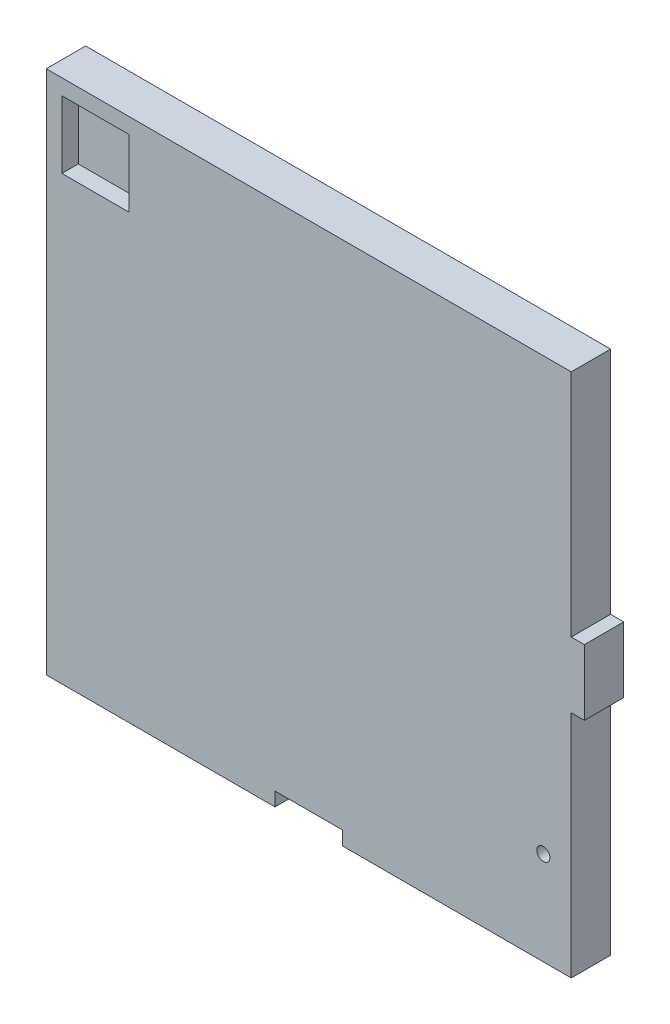
ISO-10303-21;
HEADER;
FILE_DESCRIPTION(('STEP AP214'),'2;1');
FILE_NAME('part.step','',(''),(''),'','','');
FILE_SCHEMA(('AUTOMOTIVE_DESIGN { 1 0 10303 214 1 1 1 1 }'));
ENDSEC;
DATA;
#1=APPLICATION_CONTEXT('core data for automotive mechanical design processes');
#2=APPLICATION_PROTOCOL_DEFINITION('international standard','automotive_design',2000,#1);
#3=PRODUCT_CONTEXT('',#1,'mechanical');
#4=PRODUCT('Part','Part','',(#3));
#5=PRODUCT_RELATED_PRODUCT_CATEGORY('part','',(#4));
#6=PRODUCT_DEFINITION_FORMATION('','',#4);
#7=PRODUCT_DEFINITION_CONTEXT('part definition',#1,'design');
#8=PRODUCT_DEFINITION('design','',#6,#7);
#9=PRODUCT_DEFINITION_SHAPE('','',#8);
#10=(LENGTH_UNIT() NAMED_UNIT(*) SI_UNIT(.MILLI.,.METRE.));
#11=(NAMED_UNIT(*) PLANE_ANGLE_UNIT() SI_UNIT($,.RADIAN.));
#12=(NAMED_UNIT(*) SI_UNIT($,.STERADIAN.) SOLID_ANGLE_UNIT());
#13=UNCERTAINTY_MEASURE_WITH_UNIT(LENGTH_MEASURE(1.E-05),#10,'distance_accuracy_value','');
#14=(GEOMETRIC_REPRESENTATION_CONTEXT(3) GLOBAL_UNCERTAINTY_ASSIGNED_CONTEXT((#13)) GLOBAL_UNIT_ASSIGNED_CONTEXT((#10,
#11,#12)) REPRESENTATION_CONTEXT('',''));
#15=CARTESIAN_POINT('',(0.,0.,0.));
#16=DIRECTION('',(0.,0.,1.));
#17=DIRECTION('',(1.,0.,0.));
#18=AXIS2_PLACEMENT_3D('',#15,#16,#17);
#19=CARTESIAN_POINT('',(151.500000000023,28.4999999999927,12.));
#20=DIRECTION('',(0.,0.,-1.));
#21=DIRECTION('',(-1.,0.,0.));
#22=AXIS2_PLACEMENT_3D('',#19,#20,#21);
#23=CYLINDRICAL_SURFACE('',#22,2.);
#24=CARTESIAN_POINT('',(151.500000000023,28.4999999999927,12.));
#25=DIRECTION('',(0.,0.,1.));
#26=DIRECTION('',(1.,0.,0.));
#27=AXIS2_PLACEMENT_3D('',#24,#25,#26);
#28=CIRCLE('',#27,2.);
#29=CARTESIAN_POINT('',(153.500000000023,28.4999999999927,12.));
#30=VERTEX_POINT('',#29);
#31=EDGE_CURVE('E176',#30,#30,#28,.T.);
#32=ORIENTED_EDGE('',*,*,#31,.T.);
#33=EDGE_LOOP('',(#32));
#34=FACE_BOUND('',#33,.T.);
#35=CARTESIAN_POINT('',(151.500000000023,28.4999999999927,8.));
#36=DIRECTION('',(0.,0.,-1.));
#37=DIRECTION('',(-1.,0.,0.));
#38=AXIS2_PLACEMENT_3D('',#35,#36,#37);
#39=CIRCLE('',#38,2.);
#40=CARTESIAN_POINT('',(149.500000000023,28.4999999999927,8.));
#41=VERTEX_POINT('',#40);
#42=EDGE_CURVE('E43',#41,#41,#39,.T.);
#43=ORIENTED_EDGE('',*,*,#42,.T.);
#44=EDGE_LOOP('',(#43));
#45=FACE_BOUND('',#44,.T.);
#46=ADVANCED_FACE('F39',(#34,#45),#23,.F.);
#47=CARTESIAN_POINT('',(0.,0.,12.));
#48=DIRECTION('',(0.,0.,1.));
#49=DIRECTION('',(1.,0.,0.));
#50=AXIS2_PLACEMENT_3D('',#47,#48,#49);
#51=PLANE('',#50);
#52=DIRECTION('',(0.,-1.,0.));
#53=VECTOR('',#52,1.);
#54=CARTESIAN_POINT('',(4.75,155.25,12.));
#55=LINE('',#54,#53);
#56=CARTESIAN_POINT('',(4.75,155.25,12.));
#57=VERTEX_POINT('',#56);
#58=CARTESIAN_POINT('',(4.75,134.75,12.));
#59=VERTEX_POINT('',#58);
#60=EDGE_CURVE('E54',#57,#59,#55,.T.);
#61=ORIENTED_EDGE('',*,*,#60,.F.);
#62=DIRECTION('',(-1.,0.,0.));
#63=VECTOR('',#62,1.);
#64=CARTESIAN_POINT('',(25.25,155.25,12.));
#65=LINE('',#64,#63);
#66=CARTESIAN_POINT('',(25.25,155.25,12.));
#67=VERTEX_POINT('',#66);
#68=EDGE_CURVE('E283',#67,#57,#65,.T.);
#69=ORIENTED_EDGE('',*,*,#68,.F.);
#70=DIRECTION('',(0.,1.,0.));
#71=VECTOR('',#70,1.);
#72=CARTESIAN_POINT('',(25.25,134.75,12.));
#73=LINE('',#72,#71);
#74=CARTESIAN_POINT('',(25.25,134.75,12.));
#75=VERTEX_POINT('',#74);
#76=EDGE_CURVE('E286',#75,#67,#73,.T.);
#77=ORIENTED_EDGE('',*,*,#76,.F.);
#78=DIRECTION('',(1.,0.,0.));
#79=VECTOR('',#78,1.);
#80=CARTESIAN_POINT('',(4.75,134.75,12.));
#81=LINE('',#80,#79);
#82=EDGE_CURVE('E292',#59,#75,#81,.T.);
#83=ORIENTED_EDGE('',*,*,#82,.F.);
#84=EDGE_LOOP('',(#61,#69,#77,#83));
#85=FACE_BOUND('',#84,.T.);
#86=DIRECTION('',(0.,-1.,0.));
#87=VECTOR('',#86,1.);
#88=CARTESIAN_POINT('',(0.,69.7,12.));
#89=LINE('',#88,#87);
#90=CARTESIAN_POINT('',(0.,160.,12.));
#91=VERTEX_POINT('',#90);
#92=CARTESIAN_POINT('',(0.,0.,12.));
#93=VERTEX_POINT('',#92);
#94=EDGE_CURVE('E196',#91,#93,#89,.T.);
#95=ORIENTED_EDGE('',*,*,#94,.T.);
#96=DIRECTION('',(1.,0.,0.));
#97=VECTOR('',#96,1.);
#98=CARTESIAN_POINT('',(0.,0.,12.));
#99=LINE('',#98,#97);
#100=CARTESIAN_POINT('',(69.7,0.,12.));
#101=VERTEX_POINT('',#100);
#102=EDGE_CURVE('E116',#93,#101,#99,.T.);
#103=ORIENTED_EDGE('',*,*,#102,.T.);
#104=DIRECTION('',(0.,1.,0.));
#105=VECTOR('',#104,1.);
#106=CARTESIAN_POINT('',(69.7,0.,12.));
#107=LINE('',#106,#105);
#108=CARTESIAN_POINT('',(69.7,4.2,12.));
#109=VERTEX_POINT('',#108);
#110=EDGE_CURVE('E230',#101,#109,#107,.T.);
#111=ORIENTED_EDGE('',*,*,#110,.T.);
#112=DIRECTION('',(1.,0.,0.));
#113=VECTOR('',#112,1.);
#114=CARTESIAN_POINT('',(69.7,4.2,12.));
#115=LINE('',#114,#113);
#116=CARTESIAN_POINT('',(90.3,4.2,12.));
#117=VERTEX_POINT('',#116);
#118=EDGE_CURVE('E242',#109,#117,#115,.T.);
#119=ORIENTED_EDGE('',*,*,#118,.T.);
#120=DIRECTION('',(0.,-1.,0.));
#121=VECTOR('',#120,1.);
#122=CARTESIAN_POINT('',(90.3,4.2,12.));
#123=LINE('',#122,#121);
#124=CARTESIAN_POINT('',(90.3,0.,12.));
#125=VERTEX_POINT('',#124);
#126=EDGE_CURVE('E238',#117,#125,#123,.T.);
#127=ORIENTED_EDGE('',*,*,#126,.T.);
#128=DIRECTION('',(1.,0.,0.));
#129=VECTOR('',#128,1.);
#130=CARTESIAN_POINT('',(90.3,0.,12.));
#131=LINE('',#130,#129);
#132=CARTESIAN_POINT('',(160.,0.,12.));
#133=VERTEX_POINT('',#132);
#134=EDGE_CURVE('E245',#125,#133,#131,.T.);
#135=ORIENTED_EDGE('',*,*,#134,.T.);
#136=DIRECTION('',(0.,1.,0.));
#137=VECTOR('',#136,1.);
#138=CARTESIAN_POINT('',(160.,0.,12.));
#139=LINE('',#138,#137);
#140=CARTESIAN_POINT('',(160.,70.,12.));
#141=VERTEX_POINT('',#140);
#142=EDGE_CURVE('E244',#133,#141,#139,.T.);
#143=ORIENTED_EDGE('',*,*,#142,.T.);
#144=DIRECTION('',(1.,0.,0.));
#145=VECTOR('',#144,1.);
#146=CARTESIAN_POINT('',(160.,70.,12.));
#147=LINE('',#146,#145);
#148=CARTESIAN_POINT('',(164.,70.,12.));
#149=VERTEX_POINT('',#148);
#150=EDGE_CURVE('E253',#141,#149,#147,.T.);
#151=ORIENTED_EDGE('',*,*,#150,.T.);
#152=DIRECTION('',(0.,1.,0.));
#153=VECTOR('',#152,1.);
#154=CARTESIAN_POINT('',(164.,70.,12.));
#155=LINE('',#154,#153);
#156=CARTESIAN_POINT('',(164.,90.,12.));
#157=VERTEX_POINT('',#156);
#158=EDGE_CURVE('E155',#149,#157,#155,.T.);
#159=ORIENTED_EDGE('',*,*,#158,.T.);
#160=DIRECTION('',(-1.,0.,0.));
#161=VECTOR('',#160,1.);
#162=CARTESIAN_POINT('',(164.,90.,12.));
#163=LINE('',#162,#161);
#164=CARTESIAN_POINT('',(160.,90.,12.));
#165=VERTEX_POINT('',#164);
#166=EDGE_CURVE('E145',#157,#165,#163,.T.);
#167=ORIENTED_EDGE('',*,*,#166,.T.);
#168=DIRECTION('',(0.,1.,0.));
#169=VECTOR('',#168,1.);
#170=CARTESIAN_POINT('',(160.,90.,12.));
#171=LINE('',#170,#169);
#172=CARTESIAN_POINT('',(160.,160.,12.));
#173=VERTEX_POINT('',#172);
#174=EDGE_CURVE('E149',#165,#173,#171,.T.);
#175=ORIENTED_EDGE('',*,*,#174,.T.);
#176=DIRECTION('',(-1.,0.,0.));
#177=VECTOR('',#176,1.);
#178=CARTESIAN_POINT('',(160.,160.,12.));
#179=LINE('',#178,#177);
#180=EDGE_CURVE('E63',#173,#91,#179,.T.);
#181=ORIENTED_EDGE('',*,*,#180,.T.);
#182=EDGE_LOOP('',(#95,#103,#111,#119,#127,#135,#143,#151,#159,#167,#175,#181));
#183=FACE_BOUND('',#182,.T.);
#184=ORIENTED_EDGE('',*,*,#31,.F.);
#185=EDGE_LOOP('',(#184));
#186=FACE_BOUND('',#185,.T.);
#187=ADVANCED_FACE('F148',(#85,#183,#186),#51,.T.);
#188=CARTESIAN_POINT('',(0.,0.,0.));
#189=DIRECTION('',(0.,0.,1.));
#190=DIRECTION('',(1.,0.,0.));
#191=AXIS2_PLACEMENT_3D('',#188,#189,#190);
#192=PLANE('',#191);
#193=CARTESIAN_POINT('',(151.500000000023,28.4999999999927,0.));
#194=DIRECTION('',(0.,0.,-1.));
#195=DIRECTION('',(-1.,0.,0.));
#196=AXIS2_PLACEMENT_3D('',#193,#194,#195);
#197=CIRCLE('',#196,3.45);
#198=CARTESIAN_POINT('',(148.050000000023,28.4999999999927,0.));
#199=VERTEX_POINT('',#198);
#200=EDGE_CURVE('E304',#199,#199,#197,.T.);
#201=ORIENTED_EDGE('',*,*,#200,.F.);
#202=EDGE_LOOP('',(#201));
#203=FACE_BOUND('',#202,.T.);
#204=DIRECTION('',(1.,0.,0.));
#205=VECTOR('',#204,1.);
#206=CARTESIAN_POINT('',(0.,0.,0.));
#207=LINE('',#206,#205);
#208=CARTESIAN_POINT('',(0.,0.,0.));
#209=VERTEX_POINT('',#208);
#210=CARTESIAN_POINT('',(69.7,0.,0.));
#211=VERTEX_POINT('',#210);
#212=EDGE_CURVE('E174',#209,#211,#207,.T.);
#213=ORIENTED_EDGE('',*,*,#212,.F.);
#214=DIRECTION('',(0.,-1.,0.));
#215=VECTOR('',#214,1.);
#216=CARTESIAN_POINT('',(0.,90.3,0.));
#217=LINE('',#216,#215);
#218=CARTESIAN_POINT('',(0.,160.,0.));
#219=VERTEX_POINT('',#218);
#220=EDGE_CURVE('E107',#219,#209,#217,.T.);
#221=ORIENTED_EDGE('',*,*,#220,.F.);
#222=DIRECTION('',(-1.,0.,0.));
#223=VECTOR('',#222,1.);
#224=CARTESIAN_POINT('',(70.,160.,0.));
#225=LINE('',#224,#223);
#226=CARTESIAN_POINT('',(160.,160.,0.));
#227=VERTEX_POINT('',#226);
#228=EDGE_CURVE('E194',#227,#219,#225,.T.);
#229=ORIENTED_EDGE('',*,*,#228,.F.);
#230=DIRECTION('',(0.,1.,0.));
#231=VECTOR('',#230,1.);
#232=CARTESIAN_POINT('',(160.,90.,0.));
#233=LINE('',#232,#231);
#234=CARTESIAN_POINT('',(160.,90.,0.));
#235=VERTEX_POINT('',#234);
#236=EDGE_CURVE('E191',#235,#227,#233,.T.);
#237=ORIENTED_EDGE('',*,*,#236,.F.);
#238=DIRECTION('',(-1.,0.,0.));
#239=VECTOR('',#238,1.);
#240=CARTESIAN_POINT('',(164.,90.,0.));
#241=LINE('',#240,#239);
#242=CARTESIAN_POINT('',(164.,90.,0.));
#243=VERTEX_POINT('',#242);
#244=EDGE_CURVE('E161',#243,#235,#241,.T.);
#245=ORIENTED_EDGE('',*,*,#244,.F.);
#246=DIRECTION('',(0.,1.,0.));
#247=VECTOR('',#246,1.);
#248=CARTESIAN_POINT('',(164.,70.,0.));
#249=LINE('',#248,#247);
#250=CARTESIAN_POINT('',(164.,70.,0.));
#251=VERTEX_POINT('',#250);
#252=EDGE_CURVE('E189',#251,#243,#249,.T.);
#253=ORIENTED_EDGE('',*,*,#252,.F.);
#254=DIRECTION('',(1.,0.,0.));
#255=VECTOR('',#254,1.);
#256=CARTESIAN_POINT('',(160.,70.,0.));
#257=LINE('',#256,#255);
#258=CARTESIAN_POINT('',(160.,70.,0.));
#259=VERTEX_POINT('',#258);
#260=EDGE_CURVE('E187',#259,#251,#257,.T.);
#261=ORIENTED_EDGE('',*,*,#260,.F.);
#262=DIRECTION('',(0.,1.,0.));
#263=VECTOR('',#262,1.);
#264=CARTESIAN_POINT('',(160.,0.,0.));
#265=LINE('',#264,#263);
#266=CARTESIAN_POINT('',(160.,0.,0.));
#267=VERTEX_POINT('',#266);
#268=EDGE_CURVE('E186',#267,#259,#265,.T.);
#269=ORIENTED_EDGE('',*,*,#268,.F.);
#270=DIRECTION('',(1.,0.,0.));
#271=VECTOR('',#270,1.);
#272=CARTESIAN_POINT('',(90.3,0.,0.));
#273=LINE('',#272,#271);
#274=CARTESIAN_POINT('',(90.3,0.,0.));
#275=VERTEX_POINT('',#274);
#276=EDGE_CURVE('E184',#275,#267,#273,.T.);
#277=ORIENTED_EDGE('',*,*,#276,.F.);
#278=DIRECTION('',(0.,-1.,0.));
#279=VECTOR('',#278,1.);
#280=CARTESIAN_POINT('',(90.3,4.2,0.));
#281=LINE('',#280,#279);
#282=CARTESIAN_POINT('',(90.3,4.2,0.));
#283=VERTEX_POINT('',#282);
#284=EDGE_CURVE('E185',#283,#275,#281,.T.);
#285=ORIENTED_EDGE('',*,*,#284,.F.);
#286=DIRECTION('',(1.,0.,0.));
#287=VECTOR('',#286,1.);
#288=CARTESIAN_POINT('',(69.7,4.2,0.));
#289=LINE('',#288,#287);
#290=CARTESIAN_POINT('',(69.7,4.2,0.));
#291=VERTEX_POINT('',#290);
#292=EDGE_CURVE('E179',#291,#283,#289,.T.);
#293=ORIENTED_EDGE('',*,*,#292,.F.);
#294=DIRECTION('',(0.,1.,0.));
#295=VECTOR('',#294,1.);
#296=CARTESIAN_POINT('',(69.7,0.,0.));
#297=LINE('',#296,#295);
#298=EDGE_CURVE('E180',#211,#291,#297,.T.);
#299=ORIENTED_EDGE('',*,*,#298,.F.);
#300=EDGE_LOOP('',(#213,#221,#229,#237,#245,#253,#261,#269,#277,#285,#293,#299));
#301=FACE_BOUND('',#300,.T.);
#302=ADVANCED_FACE('F228',(#203,#301),#192,.F.);
#303=CARTESIAN_POINT('',(0.,0.,12.));
#304=DIRECTION('',(0.,1.,0.));
#305=DIRECTION('',(0.,0.,1.));
#306=AXIS2_PLACEMENT_3D('',#303,#304,#305);
#307=PLANE('',#306);
#308=ORIENTED_EDGE('',*,*,#212,.T.);
#309=DIRECTION('',(0.,0.,-1.));
#310=VECTOR('',#309,1.);
#311=CARTESIAN_POINT('',(69.7,0.,12.));
#312=LINE('',#311,#310);
#313=EDGE_CURVE('E48',#101,#211,#312,.T.);
#314=ORIENTED_EDGE('',*,*,#313,.F.);
#315=ORIENTED_EDGE('',*,*,#102,.F.);
#316=DIRECTION('',(0.,0.,-1.));
#317=VECTOR('',#316,1.);
#318=CARTESIAN_POINT('',(0.,0.,12.));
#319=LINE('',#318,#317);
#320=EDGE_CURVE('E11',#93,#209,#319,.T.);
#321=ORIENTED_EDGE('',*,*,#320,.T.);
#322=EDGE_LOOP('',(#308,#314,#315,#321));
#323=FACE_BOUND('',#322,.T.);
#324=ADVANCED_FACE('F41',(#323),#307,.F.);
#325=CARTESIAN_POINT('',(69.7,0.,12.));
#326=DIRECTION('',(-1.,0.,0.));
#327=DIRECTION('',(0.,0.,1.));
#328=AXIS2_PLACEMENT_3D('',#325,#326,#327);
#329=PLANE('',#328);
#330=ORIENTED_EDGE('',*,*,#298,.T.);
#331=DIRECTION('',(0.,0.,-1.));
#332=VECTOR('',#331,1.);
#333=CARTESIAN_POINT('',(69.7,4.2,12.));
#334=LINE('',#333,#332);
#335=EDGE_CURVE('E217',#109,#291,#334,.T.);
#336=ORIENTED_EDGE('',*,*,#335,.F.);
#337=ORIENTED_EDGE('',*,*,#110,.F.);
#338=ORIENTED_EDGE('',*,*,#313,.T.);
#339=EDGE_LOOP('',(#330,#336,#337,#338));
#340=FACE_BOUND('',#339,.T.);
#341=ADVANCED_FACE('F223',(#340),#329,.F.);
#342=CARTESIAN_POINT('',(69.7,4.2,12.));
#343=DIRECTION('',(0.,1.,0.));
#344=DIRECTION('',(0.,0.,1.));
#345=AXIS2_PLACEMENT_3D('',#342,#343,#344);
#346=PLANE('',#345);
#347=ORIENTED_EDGE('',*,*,#292,.T.);
#348=DIRECTION('',(0.,0.,-1.));
#349=VECTOR('',#348,1.);
#350=CARTESIAN_POINT('',(90.3,4.2,12.));
#351=LINE('',#350,#349);
#352=EDGE_CURVE('E214',#117,#283,#351,.T.);
#353=ORIENTED_EDGE('',*,*,#352,.F.);
#354=ORIENTED_EDGE('',*,*,#118,.F.);
#355=ORIENTED_EDGE('',*,*,#335,.T.);
#356=EDGE_LOOP('',(#347,#353,#354,#355));
#357=FACE_BOUND('',#356,.T.);
#358=ADVANCED_FACE('F232',(#357),#346,.F.);
#359=CARTESIAN_POINT('',(90.3,4.2,12.));
#360=DIRECTION('',(1.,0.,0.));
#361=DIRECTION('',(0.,0.,-1.));
#362=AXIS2_PLACEMENT_3D('',#359,#360,#361);
#363=PLANE('',#362);
#364=ORIENTED_EDGE('',*,*,#284,.T.);
#365=DIRECTION('',(0.,0.,-1.));
#366=VECTOR('',#365,1.);
#367=CARTESIAN_POINT('',(90.3,0.,12.));
#368=LINE('',#367,#366);
#369=EDGE_CURVE('E215',#125,#275,#368,.T.);
#370=ORIENTED_EDGE('',*,*,#369,.F.);
#371=ORIENTED_EDGE('',*,*,#126,.F.);
#372=ORIENTED_EDGE('',*,*,#352,.T.);
#373=EDGE_LOOP('',(#364,#370,#371,#372));
#374=FACE_BOUND('',#373,.T.);
#375=ADVANCED_FACE('F236',(#374),#363,.F.);
#376=CARTESIAN_POINT('',(90.3,0.,12.));
#377=DIRECTION('',(0.,1.,0.));
#378=DIRECTION('',(0.,0.,1.));
#379=AXIS2_PLACEMENT_3D('',#376,#377,#378);
#380=PLANE('',#379);
#381=ORIENTED_EDGE('',*,*,#276,.T.);
#382=DIRECTION('',(0.,0.,-1.));
#383=VECTOR('',#382,1.);
#384=CARTESIAN_POINT('',(160.,0.,12.));
#385=LINE('',#384,#383);
#386=EDGE_CURVE('E207',#133,#267,#385,.T.);
#387=ORIENTED_EDGE('',*,*,#386,.F.);
#388=ORIENTED_EDGE('',*,*,#134,.F.);
#389=ORIENTED_EDGE('',*,*,#369,.T.);
#390=EDGE_LOOP('',(#381,#387,#388,#389));
#391=FACE_BOUND('',#390,.T.);
#392=ADVANCED_FACE('F360',(#391),#380,.F.);
#393=CARTESIAN_POINT('',(160.,0.,12.));
#394=DIRECTION('',(-1.,0.,0.));
#395=DIRECTION('',(0.,0.,1.));
#396=AXIS2_PLACEMENT_3D('',#393,#394,#395);
#397=PLANE('',#396);
#398=ORIENTED_EDGE('',*,*,#268,.T.);
#399=DIRECTION('',(0.,0.,-1.));
#400=VECTOR('',#399,1.);
#401=CARTESIAN_POINT('',(160.,70.,12.));
#402=LINE('',#401,#400);
#403=EDGE_CURVE('E206',#141,#259,#402,.T.);
#404=ORIENTED_EDGE('',*,*,#403,.F.);
#405=ORIENTED_EDGE('',*,*,#142,.F.);
#406=ORIENTED_EDGE('',*,*,#386,.T.);
#407=EDGE_LOOP('',(#398,#404,#405,#406));
#408=FACE_BOUND('',#407,.T.);
#409=ADVANCED_FACE('F353',(#408),#397,.F.);
#410=CARTESIAN_POINT('',(160.,70.,12.));
#411=DIRECTION('',(0.,1.,0.));
#412=DIRECTION('',(0.,0.,1.));
#413=AXIS2_PLACEMENT_3D('',#410,#411,#412);
#414=PLANE('',#413);
#415=ORIENTED_EDGE('',*,*,#260,.T.);
#416=DIRECTION('',(0.,0.,-1.));
#417=VECTOR('',#416,1.);
#418=CARTESIAN_POINT('',(164.,70.,12.));
#419=LINE('',#418,#417);
#420=EDGE_CURVE('E201',#149,#251,#419,.T.);
#421=ORIENTED_EDGE('',*,*,#420,.F.);
#422=ORIENTED_EDGE('',*,*,#150,.F.);
#423=ORIENTED_EDGE('',*,*,#403,.T.);
#424=EDGE_LOOP('',(#415,#421,#422,#423));
#425=FACE_BOUND('',#424,.T.);
#426=ADVANCED_FACE('F260',(#425),#414,.F.);
#427=CARTESIAN_POINT('',(164.,70.,12.));
#428=DIRECTION('',(-1.,0.,0.));
#429=DIRECTION('',(0.,0.,1.));
#430=AXIS2_PLACEMENT_3D('',#427,#428,#429);
#431=PLANE('',#430);
#432=ORIENTED_EDGE('',*,*,#252,.T.);
#433=DIRECTION('',(0.,0.,-1.));
#434=VECTOR('',#433,1.);
#435=CARTESIAN_POINT('',(164.,90.,12.));
#436=LINE('',#435,#434);
#437=EDGE_CURVE('E164',#157,#243,#436,.T.);
#438=ORIENTED_EDGE('',*,*,#437,.F.);
#439=ORIENTED_EDGE('',*,*,#158,.F.);
#440=ORIENTED_EDGE('',*,*,#420,.T.);
#441=EDGE_LOOP('',(#432,#438,#439,#440));
#442=FACE_BOUND('',#441,.T.);
#443=ADVANCED_FACE('F261',(#442),#431,.F.);
#444=CARTESIAN_POINT('',(164.,90.,12.));
#445=DIRECTION('',(0.,-1.,0.));
#446=DIRECTION('',(0.,0.,-1.));
#447=AXIS2_PLACEMENT_3D('',#444,#445,#446);
#448=PLANE('',#447);
#449=ORIENTED_EDGE('',*,*,#244,.T.);
#450=DIRECTION('',(0.,0.,-1.));
#451=VECTOR('',#450,1.);
#452=CARTESIAN_POINT('',(160.,90.,12.));
#453=LINE('',#452,#451);
#454=EDGE_CURVE('E158',#165,#235,#453,.T.);
#455=ORIENTED_EDGE('',*,*,#454,.F.);
#456=ORIENTED_EDGE('',*,*,#166,.F.);
#457=ORIENTED_EDGE('',*,*,#437,.T.);
#458=EDGE_LOOP('',(#449,#455,#456,#457));
#459=FACE_BOUND('',#458,.T.);
#460=ADVANCED_FACE('F157',(#459),#448,.F.);
#461=CARTESIAN_POINT('',(160.,90.,12.));
#462=DIRECTION('',(-1.,0.,0.));
#463=DIRECTION('',(0.,0.,1.));
#464=AXIS2_PLACEMENT_3D('',#461,#462,#463);
#465=PLANE('',#464);
#466=ORIENTED_EDGE('',*,*,#236,.T.);
#467=DIRECTION('',(0.,0.,-1.));
#468=VECTOR('',#467,1.);
#469=CARTESIAN_POINT('',(160.,160.,12.));
#470=LINE('',#469,#468);
#471=EDGE_CURVE('E167',#173,#227,#470,.T.);
#472=ORIENTED_EDGE('',*,*,#471,.F.);
#473=ORIENTED_EDGE('',*,*,#174,.F.);
#474=ORIENTED_EDGE('',*,*,#454,.T.);
#475=EDGE_LOOP('',(#466,#472,#473,#474));
#476=FACE_BOUND('',#475,.T.);
#477=ADVANCED_FACE('F169',(#476),#465,.F.);
#478=CARTESIAN_POINT('',(70.,160.,12.));
#479=DIRECTION('',(0.,-1.,0.));
#480=DIRECTION('',(0.,0.,-1.));
#481=AXIS2_PLACEMENT_3D('',#478,#479,#480);
#482=PLANE('',#481);
#483=ORIENTED_EDGE('',*,*,#228,.T.);
#484=DIRECTION('',(0.,0.,-1.));
#485=VECTOR('',#484,1.);
#486=CARTESIAN_POINT('',(0.,160.,12.));
#487=LINE('',#486,#485);
#488=EDGE_CURVE('E171',#91,#219,#487,.T.);
#489=ORIENTED_EDGE('',*,*,#488,.F.);
#490=ORIENTED_EDGE('',*,*,#180,.F.);
#491=ORIENTED_EDGE('',*,*,#471,.T.);
#492=EDGE_LOOP('',(#483,#489,#490,#491));
#493=FACE_BOUND('',#492,.T.);
#494=ADVANCED_FACE('F263',(#493),#482,.F.);
#495=CARTESIAN_POINT('',(0.,90.3,12.));
#496=DIRECTION('',(1.,0.,0.));
#497=DIRECTION('',(0.,0.,-1.));
#498=AXIS2_PLACEMENT_3D('',#495,#496,#497);
#499=PLANE('',#498);
#500=ORIENTED_EDGE('',*,*,#220,.T.);
#501=ORIENTED_EDGE('',*,*,#320,.F.);
#502=ORIENTED_EDGE('',*,*,#94,.F.);
#503=ORIENTED_EDGE('',*,*,#488,.T.);
#504=EDGE_LOOP('',(#500,#501,#502,#503));
#505=FACE_BOUND('',#504,.T.);
#506=ADVANCED_FACE('F266',(#505),#499,.F.);
#507=CARTESIAN_POINT('',(4.75,155.25,7.));
#508=DIRECTION('',(-1.,0.,0.));
#509=DIRECTION('',(0.,0.,1.));
#510=AXIS2_PLACEMENT_3D('',#507,#508,#509);
#511=PLANE('',#510);
#512=ORIENTED_EDGE('',*,*,#60,.T.);
#513=DIRECTION('',(0.,0.,1.));
#514=VECTOR('',#513,1.);
#515=CARTESIAN_POINT('',(4.75,134.75,7.));
#516=LINE('',#515,#514);
#517=CARTESIAN_POINT('',(4.75,134.75,7.));
#518=VERTEX_POINT('',#517);
#519=EDGE_CURVE('E273',#518,#59,#516,.T.);
#520=ORIENTED_EDGE('',*,*,#519,.F.);
#521=DIRECTION('',(0.,-1.,0.));
#522=VECTOR('',#521,1.);
#523=CARTESIAN_POINT('',(4.75,155.25,7.));
#524=LINE('',#523,#522);
#525=CARTESIAN_POINT('',(4.75,155.25,7.));
#526=VERTEX_POINT('',#525);
#527=EDGE_CURVE('E290',#526,#518,#524,.T.);
#528=ORIENTED_EDGE('',*,*,#527,.F.);
#529=DIRECTION('',(0.,0.,1.));
#530=VECTOR('',#529,1.);
#531=CARTESIAN_POINT('',(4.75,155.25,7.));
#532=LINE('',#531,#530);
#533=EDGE_CURVE('E272',#526,#57,#532,.T.);
#534=ORIENTED_EDGE('',*,*,#533,.T.);
#535=EDGE_LOOP('',(#512,#520,#528,#534));
#536=FACE_BOUND('',#535,.T.);
#537=ADVANCED_FACE('F340',(#536),#511,.F.);
#538=CARTESIAN_POINT('',(25.25,155.25,7.));
#539=DIRECTION('',(0.,1.,0.));
#540=DIRECTION('',(0.,0.,1.));
#541=AXIS2_PLACEMENT_3D('',#538,#539,#540);
#542=PLANE('',#541);
#543=ORIENTED_EDGE('',*,*,#68,.T.);
#544=ORIENTED_EDGE('',*,*,#533,.F.);
#545=DIRECTION('',(-1.,0.,0.));
#546=VECTOR('',#545,1.);
#547=CARTESIAN_POINT('',(25.25,155.25,7.));
#548=LINE('',#547,#546);
#549=CARTESIAN_POINT('',(25.25,155.25,7.));
#550=VERTEX_POINT('',#549);
#551=EDGE_CURVE('E280',#550,#526,#548,.T.);
#552=ORIENTED_EDGE('',*,*,#551,.F.);
#553=DIRECTION('',(0.,0.,1.));
#554=VECTOR('',#553,1.);
#555=CARTESIAN_POINT('',(25.25,155.25,7.));
#556=LINE('',#555,#554);
#557=EDGE_CURVE('E278',#550,#67,#556,.T.);
#558=ORIENTED_EDGE('',*,*,#557,.T.);
#559=EDGE_LOOP('',(#543,#544,#552,#558));
#560=FACE_BOUND('',#559,.T.);
#561=ADVANCED_FACE('F465',(#560),#542,.F.);
#562=CARTESIAN_POINT('',(25.25,134.75,7.));
#563=DIRECTION('',(1.,0.,0.));
#564=DIRECTION('',(0.,0.,-1.));
#565=AXIS2_PLACEMENT_3D('',#562,#563,#564);
#566=PLANE('',#565);
#567=ORIENTED_EDGE('',*,*,#76,.T.);
#568=ORIENTED_EDGE('',*,*,#557,.F.);
#569=DIRECTION('',(0.,1.,0.));
#570=VECTOR('',#569,1.);
#571=CARTESIAN_POINT('',(25.25,134.75,7.));
#572=LINE('',#571,#570);
#573=CARTESIAN_POINT('',(25.25,134.75,7.));
#574=VERTEX_POINT('',#573);
#575=EDGE_CURVE('E300',#574,#550,#572,.T.);
#576=ORIENTED_EDGE('',*,*,#575,.F.);
#577=DIRECTION('',(0.,0.,1.));
#578=VECTOR('',#577,1.);
#579=CARTESIAN_POINT('',(25.25,134.75,7.));
#580=LINE('',#579,#578);
#581=EDGE_CURVE('E277',#574,#75,#580,.T.);
#582=ORIENTED_EDGE('',*,*,#581,.T.);
#583=EDGE_LOOP('',(#567,#568,#576,#582));
#584=FACE_BOUND('',#583,.T.);
#585=ADVANCED_FACE('F469',(#584),#566,.F.);
#586=CARTESIAN_POINT('',(4.75,134.75,7.));
#587=DIRECTION('',(0.,-1.,0.));
#588=DIRECTION('',(0.,0.,-1.));
#589=AXIS2_PLACEMENT_3D('',#586,#587,#588);
#590=PLANE('',#589);
#591=ORIENTED_EDGE('',*,*,#82,.T.);
#592=ORIENTED_EDGE('',*,*,#581,.F.);
#593=DIRECTION('',(1.,0.,0.));
#594=VECTOR('',#593,1.);
#595=CARTESIAN_POINT('',(4.75,134.75,7.));
#596=LINE('',#595,#594);
#597=EDGE_CURVE('E299',#518,#574,#596,.T.);
#598=ORIENTED_EDGE('',*,*,#597,.F.);
#599=ORIENTED_EDGE('',*,*,#519,.T.);
#600=EDGE_LOOP('',(#591,#592,#598,#599));
#601=FACE_BOUND('',#600,.T.);
#602=ADVANCED_FACE('F477',(#601),#590,.F.);
#603=CARTESIAN_POINT('',(0.,0.,7.));
#604=DIRECTION('',(0.,0.,1.));
#605=DIRECTION('',(1.,0.,0.));
#606=AXIS2_PLACEMENT_3D('',#603,#604,#605);
#607=PLANE('',#606);
#608=ORIENTED_EDGE('',*,*,#527,.T.);
#609=ORIENTED_EDGE('',*,*,#597,.T.);
#610=ORIENTED_EDGE('',*,*,#575,.T.);
#611=ORIENTED_EDGE('',*,*,#551,.T.);
#612=EDGE_LOOP('',(#608,#609,#610,#611));
#613=FACE_BOUND('',#612,.T.);
#614=ADVANCED_FACE('F323',(#613),#607,.T.);
#615=CARTESIAN_POINT('',(151.500000000023,28.4999999999927,8.));
#616=DIRECTION('',(0.,0.,-1.));
#617=DIRECTION('',(-1.,0.,0.));
#618=AXIS2_PLACEMENT_3D('',#615,#616,#617);
#619=CYLINDRICAL_SURFACE('',#618,3.45);
#620=CARTESIAN_POINT('',(151.500000000023,28.4999999999927,8.));
#621=DIRECTION('',(0.,0.,-1.));
#622=DIRECTION('',(-1.,0.,0.));
#623=AXIS2_PLACEMENT_3D('',#620,#621,#622);
#624=CIRCLE('',#623,3.45);
#625=CARTESIAN_POINT('',(148.050000000023,28.4999999999927,8.));
#626=VERTEX_POINT('',#625);
#627=EDGE_CURVE('E306',#626,#626,#624,.T.);
#628=ORIENTED_EDGE('',*,*,#627,.F.);
#629=EDGE_LOOP('',(#628));
#630=FACE_BOUND('',#629,.T.);
#631=ORIENTED_EDGE('',*,*,#200,.T.);
#632=EDGE_LOOP('',(#631));
#633=FACE_BOUND('',#632,.T.);
#634=ADVANCED_FACE('F318',(#630,#633),#619,.F.);
#635=CARTESIAN_POINT('',(151.500000000023,28.4999999999927,8.));
#636=DIRECTION('',(0.,0.,-1.));
#637=DIRECTION('',(-1.,0.,0.));
#638=AXIS2_PLACEMENT_3D('',#635,#636,#637);
#639=PLANE('',#638);
#640=ORIENTED_EDGE('',*,*,#42,.F.);
#641=EDGE_LOOP('',(#640));
#642=FACE_BOUND('',#641,.T.);
#643=ORIENTED_EDGE('',*,*,#627,.T.);
#644=EDGE_LOOP('',(#643));
#645=FACE_BOUND('',#644,.T.);
#646=ADVANCED_FACE('F316',(#642,#645),#639,.T.);
#647=CLOSED_SHELL('',(#46,#187,#302,#324,#341,#358,#375,#392,#409,#426,#443,#460,#477,#494,#506,
#537,#561,#585,#602,#614,#634,#646));
#648=MANIFOLD_SOLID_BREP('B2',#647);
#649=ADVANCED_BREP_SHAPE_REPRESENTATION('',(#18,#648),#14);
#650=SHAPE_DEFINITION_REPRESENTATION(#9,#649);
ENDSEC;
END-ISO-10303-21;
